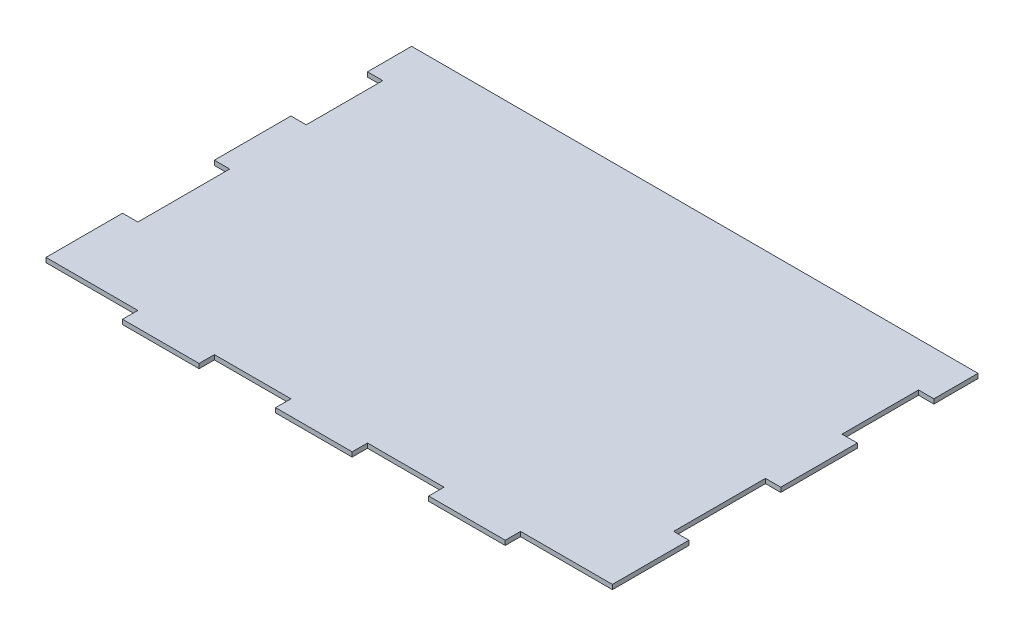
ISO-10303-21;
HEADER;
FILE_DESCRIPTION(('STEP AP214'),'2;1');
FILE_NAME('part.step','',(''),(''),'','','');
FILE_SCHEMA(('AUTOMOTIVE_DESIGN { 1 0 10303 214 1 1 1 1 }'));
ENDSEC;
DATA;
#1=APPLICATION_CONTEXT('core data for automotive mechanical design processes');
#2=APPLICATION_PROTOCOL_DEFINITION('international standard','automotive_design',2000,#1);
#3=PRODUCT_CONTEXT('',#1,'mechanical');
#4=PRODUCT('Part','Part','',(#3));
#5=PRODUCT_RELATED_PRODUCT_CATEGORY('part','',(#4));
#6=PRODUCT_DEFINITION_FORMATION('','',#4);
#7=PRODUCT_DEFINITION_CONTEXT('part definition',#1,'design');
#8=PRODUCT_DEFINITION('design','',#6,#7);
#9=PRODUCT_DEFINITION_SHAPE('','',#8);
#10=(LENGTH_UNIT() NAMED_UNIT(*) SI_UNIT(.MILLI.,.METRE.));
#11=(NAMED_UNIT(*) PLANE_ANGLE_UNIT() SI_UNIT($,.RADIAN.));
#12=(NAMED_UNIT(*) SI_UNIT($,.STERADIAN.) SOLID_ANGLE_UNIT());
#13=UNCERTAINTY_MEASURE_WITH_UNIT(LENGTH_MEASURE(1.E-05),#10,'distance_accuracy_value','');
#14=(GEOMETRIC_REPRESENTATION_CONTEXT(3) GLOBAL_UNCERTAINTY_ASSIGNED_CONTEXT((#13)) GLOBAL_UNIT_ASSIGNED_CONTEXT((#10,
#11,#12)) REPRESENTATION_CONTEXT('',''));
#15=CARTESIAN_POINT('',(0.,0.,0.));
#16=DIRECTION('',(0.,0.,1.));
#17=DIRECTION('',(1.,0.,0.));
#18=AXIS2_PLACEMENT_3D('',#15,#16,#17);
#19=CARTESIAN_POINT('',(75.0000000000001,3.,0.));
#20=DIRECTION('',(1.,0.,0.));
#21=DIRECTION('',(0.,0.,-1.));
#22=AXIS2_PLACEMENT_3D('',#19,#20,#21);
#23=PLANE('',#22);
#24=DIRECTION('',(0.,0.,1.));
#25=VECTOR('',#24,1.);
#26=CARTESIAN_POINT('',(75.0000000000001,0.,0.));
#27=LINE('',#26,#25);
#28=CARTESIAN_POINT('',(75.0000000000001,0.,149.434059405941));
#29=VERTEX_POINT('',#28);
#30=CARTESIAN_POINT('',(75.0000000000001,0.,159.434059405941));
#31=VERTEX_POINT('',#30);
#32=EDGE_CURVE('E276',#29,#31,#27,.T.);
#33=ORIENTED_EDGE('',*,*,#32,.T.);
#34=DIRECTION('',(0.,-1.,0.));
#35=VECTOR('',#34,1.);
#36=CARTESIAN_POINT('',(75.0000000000001,3.,159.434059405941));
#37=LINE('',#36,#35);
#38=CARTESIAN_POINT('',(75.0000000000001,3.,159.434059405941));
#39=VERTEX_POINT('',#38);
#40=EDGE_CURVE('E11',#39,#31,#37,.T.);
#41=ORIENTED_EDGE('',*,*,#40,.F.);
#42=DIRECTION('',(0.,0.,1.));
#43=VECTOR('',#42,1.);
#44=CARTESIAN_POINT('',(75.0000000000001,3.,0.));
#45=LINE('',#44,#43);
#46=CARTESIAN_POINT('',(75.0000000000001,3.,149.434059405941));
#47=VERTEX_POINT('',#46);
#48=EDGE_CURVE('E354',#47,#39,#45,.T.);
#49=ORIENTED_EDGE('',*,*,#48,.F.);
#50=DIRECTION('',(0.,-1.,0.));
#51=VECTOR('',#50,1.);
#52=CARTESIAN_POINT('',(75.0000000000001,3.,149.434059405941));
#53=LINE('',#52,#51);
#54=EDGE_CURVE('E272',#47,#29,#53,.T.);
#55=ORIENTED_EDGE('',*,*,#54,.T.);
#56=EDGE_LOOP('',(#33,#41,#49,#55));
#57=FACE_BOUND('',#56,.T.);
#58=ADVANCED_FACE('F36',(#57),#23,.F.);
#59=CARTESIAN_POINT('',(0.,3.,159.434059405941));
#60=DIRECTION('',(0.,0.,-1.));
#61=DIRECTION('',(-1.,0.,0.));
#62=AXIS2_PLACEMENT_3D('',#59,#60,#61);
#63=PLANE('',#62);
#64=DIRECTION('',(1.,0.,0.));
#65=VECTOR('',#64,1.);
#66=CARTESIAN_POINT('',(0.,0.,159.434059405941));
#67=LINE('',#66,#65);
#68=CARTESIAN_POINT('',(125.,0.,159.434059405941));
#69=VERTEX_POINT('',#68);
#70=EDGE_CURVE('E279',#31,#69,#67,.T.);
#71=ORIENTED_EDGE('',*,*,#70,.T.);
#72=DIRECTION('',(0.,-1.,0.));
#73=VECTOR('',#72,1.);
#74=CARTESIAN_POINT('',(125.,3.,159.434059405941));
#75=LINE('',#74,#73);
#76=CARTESIAN_POINT('',(125.,3.,159.434059405941));
#77=VERTEX_POINT('',#76);
#78=EDGE_CURVE('E44',#77,#69,#75,.T.);
#79=ORIENTED_EDGE('',*,*,#78,.F.);
#80=DIRECTION('',(1.,0.,0.));
#81=VECTOR('',#80,1.);
#82=CARTESIAN_POINT('',(0.,3.,159.434059405941));
#83=LINE('',#82,#81);
#84=EDGE_CURVE('E167',#39,#77,#83,.T.);
#85=ORIENTED_EDGE('',*,*,#84,.F.);
#86=ORIENTED_EDGE('',*,*,#40,.T.);
#87=EDGE_LOOP('',(#71,#79,#85,#86));
#88=FACE_BOUND('',#87,.T.);
#89=ADVANCED_FACE('F525',(#88),#63,.F.);
#90=CARTESIAN_POINT('',(125.,3.,0.));
#91=DIRECTION('',(-1.,0.,0.));
#92=DIRECTION('',(0.,0.,1.));
#93=AXIS2_PLACEMENT_3D('',#90,#91,#92);
#94=PLANE('',#93);
#95=DIRECTION('',(0.,0.,-1.));
#96=VECTOR('',#95,1.);
#97=CARTESIAN_POINT('',(125.,0.,0.));
#98=LINE('',#97,#96);
#99=CARTESIAN_POINT('',(125.,0.,149.434059405941));
#100=VERTEX_POINT('',#99);
#101=EDGE_CURVE('E281',#69,#100,#98,.T.);
#102=ORIENTED_EDGE('',*,*,#101,.T.);
#103=DIRECTION('',(0.,-1.,0.));
#104=VECTOR('',#103,1.);
#105=CARTESIAN_POINT('',(125.,3.,149.434059405941));
#106=LINE('',#105,#104);
#107=CARTESIAN_POINT('',(125.,3.,149.434059405941));
#108=VERTEX_POINT('',#107);
#109=EDGE_CURVE('E417',#108,#100,#106,.T.);
#110=ORIENTED_EDGE('',*,*,#109,.F.);
#111=DIRECTION('',(0.,0.,-1.));
#112=VECTOR('',#111,1.);
#113=CARTESIAN_POINT('',(125.,3.,0.));
#114=LINE('',#113,#112);
#115=EDGE_CURVE('E425',#77,#108,#114,.T.);
#116=ORIENTED_EDGE('',*,*,#115,.F.);
#117=ORIENTED_EDGE('',*,*,#78,.T.);
#118=EDGE_LOOP('',(#102,#110,#116,#117));
#119=FACE_BOUND('',#118,.T.);
#120=ADVANCED_FACE('F423',(#119),#94,.F.);
#121=CARTESIAN_POINT('',(1.65905133415679E-13,3.,149.434059405941));
#122=DIRECTION('',(0.,0.,-1.));
#123=DIRECTION('',(-1.,0.,0.));
#124=AXIS2_PLACEMENT_3D('',#121,#122,#123);
#125=PLANE('',#124);
#126=DIRECTION('',(1.,0.,0.));
#127=VECTOR('',#126,1.);
#128=CARTESIAN_POINT('',(1.65905133415679E-13,0.,149.434059405941));
#129=LINE('',#128,#127);
#130=CARTESIAN_POINT('',(185.,0.,149.434059405941));
#131=VERTEX_POINT('',#130);
#132=EDGE_CURVE('E283',#100,#131,#129,.T.);
#133=ORIENTED_EDGE('',*,*,#132,.T.);
#134=DIRECTION('',(0.,-1.,0.));
#135=VECTOR('',#134,1.);
#136=CARTESIAN_POINT('',(185.,3.,149.434059405941));
#137=LINE('',#136,#135);
#138=CARTESIAN_POINT('',(185.,3.,149.434059405941));
#139=VERTEX_POINT('',#138);
#140=EDGE_CURVE('E415',#139,#131,#137,.T.);
#141=ORIENTED_EDGE('',*,*,#140,.F.);
#142=DIRECTION('',(1.,0.,0.));
#143=VECTOR('',#142,1.);
#144=CARTESIAN_POINT('',(1.65905133415679E-13,3.,149.434059405941));
#145=LINE('',#144,#143);
#146=EDGE_CURVE('E437',#108,#139,#145,.T.);
#147=ORIENTED_EDGE('',*,*,#146,.F.);
#148=ORIENTED_EDGE('',*,*,#109,.T.);
#149=EDGE_LOOP('',(#133,#141,#147,#148));
#150=FACE_BOUND('',#149,.T.);
#151=ADVANCED_FACE('F434',(#150),#125,.F.);
#152=CARTESIAN_POINT('',(185.,3.,-1.02695629777827E-13));
#153=DIRECTION('',(1.,0.,0.));
#154=DIRECTION('',(0.,0.,-1.));
#155=AXIS2_PLACEMENT_3D('',#152,#153,#154);
#156=PLANE('',#155);
#157=DIRECTION('',(0.,0.,1.));
#158=VECTOR('',#157,1.);
#159=CARTESIAN_POINT('',(185.,0.,-1.02695629777827E-13));
#160=LINE('',#159,#158);
#161=CARTESIAN_POINT('',(185.,0.,99.4340594059405));
#162=VERTEX_POINT('',#161);
#163=EDGE_CURVE('E286',#162,#131,#160,.T.);
#164=ORIENTED_EDGE('',*,*,#163,.F.);
#165=DIRECTION('',(0.,-1.,0.));
#166=VECTOR('',#165,1.);
#167=CARTESIAN_POINT('',(185.,3.,99.4340594059405));
#168=LINE('',#167,#166);
#169=CARTESIAN_POINT('',(185.,3.,99.4340594059405));
#170=VERTEX_POINT('',#169);
#171=EDGE_CURVE('E413',#170,#162,#168,.T.);
#172=ORIENTED_EDGE('',*,*,#171,.F.);
#173=DIRECTION('',(0.,0.,1.));
#174=VECTOR('',#173,1.);
#175=CARTESIAN_POINT('',(185.,3.,-1.02695629777827E-13));
#176=LINE('',#175,#174);
#177=EDGE_CURVE('E439',#170,#139,#176,.T.);
#178=ORIENTED_EDGE('',*,*,#177,.T.);
#179=ORIENTED_EDGE('',*,*,#140,.T.);
#180=EDGE_LOOP('',(#164,#172,#178,#179));
#181=FACE_BOUND('',#180,.T.);
#182=ADVANCED_FACE('F536',(#181),#156,.T.);
#183=CARTESIAN_POINT('',(0.,3.,99.4340594059405));
#184=DIRECTION('',(0.,0.,1.));
#185=DIRECTION('',(1.,0.,0.));
#186=AXIS2_PLACEMENT_3D('',#183,#184,#185);
#187=PLANE('',#186);
#188=DIRECTION('',(-1.,0.,0.));
#189=VECTOR('',#188,1.);
#190=CARTESIAN_POINT('',(0.,0.,99.4340594059405));
#191=LINE('',#190,#189);
#192=CARTESIAN_POINT('',(175.,0.,99.4340594059405));
#193=VERTEX_POINT('',#192);
#194=EDGE_CURVE('E289',#162,#193,#191,.T.);
#195=ORIENTED_EDGE('',*,*,#194,.T.);
#196=DIRECTION('',(0.,-1.,0.));
#197=VECTOR('',#196,1.);
#198=CARTESIAN_POINT('',(175.,3.,99.4340594059405));
#199=LINE('',#198,#197);
#200=CARTESIAN_POINT('',(175.,3.,99.4340594059405));
#201=VERTEX_POINT('',#200);
#202=EDGE_CURVE('E410',#201,#193,#199,.T.);
#203=ORIENTED_EDGE('',*,*,#202,.F.);
#204=DIRECTION('',(-1.,0.,0.));
#205=VECTOR('',#204,1.);
#206=CARTESIAN_POINT('',(0.,3.,99.4340594059405));
#207=LINE('',#206,#205);
#208=EDGE_CURVE('E441',#170,#201,#207,.T.);
#209=ORIENTED_EDGE('',*,*,#208,.F.);
#210=ORIENTED_EDGE('',*,*,#171,.T.);
#211=EDGE_LOOP('',(#195,#203,#209,#210));
#212=FACE_BOUND('',#211,.T.);
#213=ADVANCED_FACE('F539',(#212),#187,.F.);
#214=CARTESIAN_POINT('',(175.,3.,0.));
#215=DIRECTION('',(-1.,0.,0.));
#216=DIRECTION('',(0.,0.,1.));
#217=AXIS2_PLACEMENT_3D('',#214,#215,#216);
#218=PLANE('',#217);
#219=DIRECTION('',(0.,0.,-1.));
#220=VECTOR('',#219,1.);
#221=CARTESIAN_POINT('',(175.,0.,0.));
#222=LINE('',#221,#220);
#223=CARTESIAN_POINT('',(175.,0.,39.4340594059406));
#224=VERTEX_POINT('',#223);
#225=EDGE_CURVE('E291',#193,#224,#222,.T.);
#226=ORIENTED_EDGE('',*,*,#225,.T.);
#227=DIRECTION('',(0.,-1.,0.));
#228=VECTOR('',#227,1.);
#229=CARTESIAN_POINT('',(175.,3.,39.4340594059406));
#230=LINE('',#229,#228);
#231=CARTESIAN_POINT('',(175.,3.,39.4340594059406));
#232=VERTEX_POINT('',#231);
#233=EDGE_CURVE('E407',#232,#224,#230,.T.);
#234=ORIENTED_EDGE('',*,*,#233,.F.);
#235=DIRECTION('',(0.,0.,-1.));
#236=VECTOR('',#235,1.);
#237=CARTESIAN_POINT('',(175.,3.,0.));
#238=LINE('',#237,#236);
#239=EDGE_CURVE('E447',#201,#232,#238,.T.);
#240=ORIENTED_EDGE('',*,*,#239,.F.);
#241=ORIENTED_EDGE('',*,*,#202,.T.);
#242=EDGE_LOOP('',(#226,#234,#240,#241));
#243=FACE_BOUND('',#242,.T.);
#244=ADVANCED_FACE('F543',(#243),#218,.F.);
#245=CARTESIAN_POINT('',(0.,3.,39.4340594059407));
#246=DIRECTION('',(0.,0.,-1.));
#247=DIRECTION('',(-1.,0.,0.));
#248=AXIS2_PLACEMENT_3D('',#245,#246,#247);
#249=PLANE('',#248);
#250=DIRECTION('',(1.,0.,0.));
#251=VECTOR('',#250,1.);
#252=CARTESIAN_POINT('',(0.,0.,39.4340594059407));
#253=LINE('',#252,#251);
#254=CARTESIAN_POINT('',(185.,0.,39.4340594059405));
#255=VERTEX_POINT('',#254);
#256=EDGE_CURVE('E293',#224,#255,#253,.T.);
#257=ORIENTED_EDGE('',*,*,#256,.T.);
#258=DIRECTION('',(0.,-1.,0.));
#259=VECTOR('',#258,1.);
#260=CARTESIAN_POINT('',(185.,3.,39.4340594059405));
#261=LINE('',#260,#259);
#262=CARTESIAN_POINT('',(185.,3.,39.4340594059405));
#263=VERTEX_POINT('',#262);
#264=EDGE_CURVE('E405',#263,#255,#261,.T.);
#265=ORIENTED_EDGE('',*,*,#264,.F.);
#266=DIRECTION('',(1.,0.,0.));
#267=VECTOR('',#266,1.);
#268=CARTESIAN_POINT('',(0.,3.,39.4340594059407));
#269=LINE('',#268,#267);
#270=EDGE_CURVE('E449',#232,#263,#269,.T.);
#271=ORIENTED_EDGE('',*,*,#270,.F.);
#272=ORIENTED_EDGE('',*,*,#233,.T.);
#273=EDGE_LOOP('',(#257,#265,#271,#272));
#274=FACE_BOUND('',#273,.T.);
#275=ADVANCED_FACE('F547',(#274),#249,.F.);
#276=CARTESIAN_POINT('',(185.,3.,-1.02695629777827E-13));
#277=DIRECTION('',(1.,0.,0.));
#278=DIRECTION('',(0.,0.,-1.));
#279=AXIS2_PLACEMENT_3D('',#276,#277,#278);
#280=PLANE('',#279);
#281=DIRECTION('',(0.,0.,1.));
#282=VECTOR('',#281,1.);
#283=CARTESIAN_POINT('',(185.,0.,-1.02695629777827E-13));
#284=LINE('',#283,#282);
#285=CARTESIAN_POINT('',(185.,0.,-10.5659405940595));
#286=VERTEX_POINT('',#285);
#287=EDGE_CURVE('E296',#286,#255,#284,.T.);
#288=ORIENTED_EDGE('',*,*,#287,.F.);
#289=DIRECTION('',(0.,-1.,0.));
#290=VECTOR('',#289,1.);
#291=CARTESIAN_POINT('',(185.,3.,-10.5659405940595));
#292=LINE('',#291,#290);
#293=CARTESIAN_POINT('',(185.,3.,-10.5659405940595));
#294=VERTEX_POINT('',#293);
#295=EDGE_CURVE('E403',#294,#286,#292,.T.);
#296=ORIENTED_EDGE('',*,*,#295,.F.);
#297=DIRECTION('',(0.,0.,1.));
#298=VECTOR('',#297,1.);
#299=CARTESIAN_POINT('',(185.,3.,-1.02695629777827E-13));
#300=LINE('',#299,#298);
#301=EDGE_CURVE('E451',#294,#263,#300,.T.);
#302=ORIENTED_EDGE('',*,*,#301,.T.);
#303=ORIENTED_EDGE('',*,*,#264,.T.);
#304=EDGE_LOOP('',(#288,#296,#302,#303));
#305=FACE_BOUND('',#304,.T.);
#306=ADVANCED_FACE('F551',(#305),#280,.T.);
#307=CARTESIAN_POINT('',(0.,3.,-10.5659405940595));
#308=DIRECTION('',(0.,0.,1.));
#309=DIRECTION('',(1.,0.,0.));
#310=AXIS2_PLACEMENT_3D('',#307,#308,#309);
#311=PLANE('',#310);
#312=DIRECTION('',(-1.,0.,0.));
#313=VECTOR('',#312,1.);
#314=CARTESIAN_POINT('',(0.,0.,-10.5659405940595));
#315=LINE('',#314,#313);
#316=CARTESIAN_POINT('',(175.,0.,-10.5659405940595));
#317=VERTEX_POINT('',#316);
#318=EDGE_CURVE('E299',#286,#317,#315,.T.);
#319=ORIENTED_EDGE('',*,*,#318,.T.);
#320=DIRECTION('',(0.,-1.,0.));
#321=VECTOR('',#320,1.);
#322=CARTESIAN_POINT('',(175.,3.,-10.5659405940595));
#323=LINE('',#322,#321);
#324=CARTESIAN_POINT('',(175.,3.,-10.5659405940595));
#325=VERTEX_POINT('',#324);
#326=EDGE_CURVE('E400',#325,#317,#323,.T.);
#327=ORIENTED_EDGE('',*,*,#326,.F.);
#328=DIRECTION('',(-1.,0.,0.));
#329=VECTOR('',#328,1.);
#330=CARTESIAN_POINT('',(0.,3.,-10.5659405940595));
#331=LINE('',#330,#329);
#332=EDGE_CURVE('E454',#294,#325,#331,.T.);
#333=ORIENTED_EDGE('',*,*,#332,.F.);
#334=ORIENTED_EDGE('',*,*,#295,.T.);
#335=EDGE_LOOP('',(#319,#327,#333,#334));
#336=FACE_BOUND('',#335,.T.);
#337=ADVANCED_FACE('F555',(#336),#311,.F.);
#338=CARTESIAN_POINT('',(175.,3.,0.));
#339=DIRECTION('',(-1.,0.,0.));
#340=DIRECTION('',(0.,0.,1.));
#341=AXIS2_PLACEMENT_3D('',#338,#339,#340);
#342=PLANE('',#341);
#343=DIRECTION('',(0.,0.,-1.));
#344=VECTOR('',#343,1.);
#345=CARTESIAN_POINT('',(175.,0.,0.));
#346=LINE('',#345,#344);
#347=CARTESIAN_POINT('',(175.,0.,-60.5659405940595));
#348=VERTEX_POINT('',#347);
#349=EDGE_CURVE('E301',#317,#348,#346,.T.);
#350=ORIENTED_EDGE('',*,*,#349,.T.);
#351=DIRECTION('',(0.,-1.,0.));
#352=VECTOR('',#351,1.);
#353=CARTESIAN_POINT('',(175.,3.,-60.5659405940595));
#354=LINE('',#353,#352);
#355=CARTESIAN_POINT('',(175.,3.,-60.5659405940595));
#356=VERTEX_POINT('',#355);
#357=EDGE_CURVE('E397',#356,#348,#354,.T.);
#358=ORIENTED_EDGE('',*,*,#357,.F.);
#359=DIRECTION('',(0.,0.,-1.));
#360=VECTOR('',#359,1.);
#361=CARTESIAN_POINT('',(175.,3.,0.));
#362=LINE('',#361,#360);
#363=EDGE_CURVE('E456',#325,#356,#362,.T.);
#364=ORIENTED_EDGE('',*,*,#363,.F.);
#365=ORIENTED_EDGE('',*,*,#326,.T.);
#366=EDGE_LOOP('',(#350,#358,#364,#365));
#367=FACE_BOUND('',#366,.T.);
#368=ADVANCED_FACE('F559',(#367),#342,.F.);
#369=CARTESIAN_POINT('',(0.,3.,-60.5659405940593));
#370=DIRECTION('',(0.,0.,-1.));
#371=DIRECTION('',(-1.,0.,0.));
#372=AXIS2_PLACEMENT_3D('',#369,#370,#371);
#373=PLANE('',#372);
#374=DIRECTION('',(1.,0.,0.));
#375=VECTOR('',#374,1.);
#376=CARTESIAN_POINT('',(0.,0.,-60.5659405940593));
#377=LINE('',#376,#375);
#378=CARTESIAN_POINT('',(185.,0.,-60.5659405940595));
#379=VERTEX_POINT('',#378);
#380=EDGE_CURVE('E303',#348,#379,#377,.T.);
#381=ORIENTED_EDGE('',*,*,#380,.T.);
#382=DIRECTION('',(0.,-1.,0.));
#383=VECTOR('',#382,1.);
#384=CARTESIAN_POINT('',(185.,3.,-60.5659405940595));
#385=LINE('',#384,#383);
#386=CARTESIAN_POINT('',(185.,3.,-60.5659405940595));
#387=VERTEX_POINT('',#386);
#388=EDGE_CURVE('E395',#387,#379,#385,.T.);
#389=ORIENTED_EDGE('',*,*,#388,.F.);
#390=DIRECTION('',(1.,0.,0.));
#391=VECTOR('',#390,1.);
#392=CARTESIAN_POINT('',(0.,3.,-60.5659405940593));
#393=LINE('',#392,#391);
#394=EDGE_CURVE('E458',#356,#387,#393,.T.);
#395=ORIENTED_EDGE('',*,*,#394,.F.);
#396=ORIENTED_EDGE('',*,*,#357,.T.);
#397=EDGE_LOOP('',(#381,#389,#395,#396));
#398=FACE_BOUND('',#397,.T.);
#399=ADVANCED_FACE('F563',(#398),#373,.F.);
#400=CARTESIAN_POINT('',(185.,3.,0.));
#401=DIRECTION('',(1.,0.,0.));
#402=DIRECTION('',(0.,0.,-1.));
#403=AXIS2_PLACEMENT_3D('',#400,#401,#402);
#404=PLANE('',#403);
#405=DIRECTION('',(0.,0.,1.));
#406=VECTOR('',#405,1.);
#407=CARTESIAN_POINT('',(185.,0.,0.));
#408=LINE('',#407,#406);
#409=CARTESIAN_POINT('',(185.,0.,-89.4059405940595));
#410=VERTEX_POINT('',#409);
#411=EDGE_CURVE('E306',#410,#379,#408,.T.);
#412=ORIENTED_EDGE('',*,*,#411,.F.);
#413=DIRECTION('',(0.,-1.,0.));
#414=VECTOR('',#413,1.);
#415=CARTESIAN_POINT('',(185.,3.,-89.4059405940595));
#416=LINE('',#415,#414);
#417=CARTESIAN_POINT('',(185.,3.,-89.4059405940595));
#418=VERTEX_POINT('',#417);
#419=EDGE_CURVE('E393',#418,#410,#416,.T.);
#420=ORIENTED_EDGE('',*,*,#419,.F.);
#421=DIRECTION('',(0.,0.,1.));
#422=VECTOR('',#421,1.);
#423=CARTESIAN_POINT('',(185.,3.,0.));
#424=LINE('',#423,#422);
#425=EDGE_CURVE('E460',#418,#387,#424,.T.);
#426=ORIENTED_EDGE('',*,*,#425,.T.);
#427=ORIENTED_EDGE('',*,*,#388,.T.);
#428=EDGE_LOOP('',(#412,#420,#426,#427));
#429=FACE_BOUND('',#428,.T.);
#430=ADVANCED_FACE('F567',(#429),#404,.T.);
#431=CARTESIAN_POINT('',(0.,3.,-89.4059405940594));
#432=DIRECTION('',(0.,0.,1.));
#433=DIRECTION('',(1.,0.,0.));
#434=AXIS2_PLACEMENT_3D('',#431,#432,#433);
#435=PLANE('',#434);
#436=DIRECTION('',(-1.,0.,0.));
#437=VECTOR('',#436,1.);
#438=CARTESIAN_POINT('',(0.,0.,-89.4059405940594));
#439=LINE('',#438,#437);
#440=CARTESIAN_POINT('',(-185.,0.,-89.4059405940594));
#441=VERTEX_POINT('',#440);
#442=EDGE_CURVE('E309',#410,#441,#439,.T.);
#443=ORIENTED_EDGE('',*,*,#442,.T.);
#444=DIRECTION('',(0.,-1.,0.));
#445=VECTOR('',#444,1.);
#446=CARTESIAN_POINT('',(-185.,3.,-89.4059405940594));
#447=LINE('',#446,#445);
#448=CARTESIAN_POINT('',(-185.,3.,-89.4059405940594));
#449=VERTEX_POINT('',#448);
#450=EDGE_CURVE('E390',#449,#441,#447,.T.);
#451=ORIENTED_EDGE('',*,*,#450,.F.);
#452=DIRECTION('',(-1.,0.,0.));
#453=VECTOR('',#452,1.);
#454=CARTESIAN_POINT('',(0.,3.,-89.4059405940594));
#455=LINE('',#454,#453);
#456=EDGE_CURVE('E463',#418,#449,#455,.T.);
#457=ORIENTED_EDGE('',*,*,#456,.F.);
#458=ORIENTED_EDGE('',*,*,#419,.T.);
#459=EDGE_LOOP('',(#443,#451,#457,#458));
#460=FACE_BOUND('',#459,.T.);
#461=ADVANCED_FACE('F571',(#460),#435,.F.);
#462=CARTESIAN_POINT('',(-185.,3.,0.));
#463=DIRECTION('',(1.,0.,0.));
#464=DIRECTION('',(0.,0.,-1.));
#465=AXIS2_PLACEMENT_3D('',#462,#463,#464);
#466=PLANE('',#465);
#467=DIRECTION('',(0.,0.,1.));
#468=VECTOR('',#467,1.);
#469=CARTESIAN_POINT('',(-185.,0.,0.));
#470=LINE('',#469,#468);
#471=CARTESIAN_POINT('',(-185.,0.,-60.5659405940594));
#472=VERTEX_POINT('',#471);
#473=EDGE_CURVE('E311',#441,#472,#470,.T.);
#474=ORIENTED_EDGE('',*,*,#473,.T.);
#475=DIRECTION('',(0.,-1.,0.));
#476=VECTOR('',#475,1.);
#477=CARTESIAN_POINT('',(-185.,3.,-60.5659405940594));
#478=LINE('',#477,#476);
#479=CARTESIAN_POINT('',(-185.,3.,-60.5659405940594));
#480=VERTEX_POINT('',#479);
#481=EDGE_CURVE('E388',#480,#472,#478,.T.);
#482=ORIENTED_EDGE('',*,*,#481,.F.);
#483=DIRECTION('',(0.,0.,1.));
#484=VECTOR('',#483,1.);
#485=CARTESIAN_POINT('',(-185.,3.,0.));
#486=LINE('',#485,#484);
#487=EDGE_CURVE('E465',#449,#480,#486,.T.);
#488=ORIENTED_EDGE('',*,*,#487,.F.);
#489=ORIENTED_EDGE('',*,*,#450,.T.);
#490=EDGE_LOOP('',(#474,#482,#488,#489));
#491=FACE_BOUND('',#490,.T.);
#492=ADVANCED_FACE('F575',(#491),#466,.F.);
#493=CARTESIAN_POINT('',(0.,3.,-60.5659405940594));
#494=DIRECTION('',(0.,0.,1.));
#495=DIRECTION('',(1.,0.,0.));
#496=AXIS2_PLACEMENT_3D('',#493,#494,#495);
#497=PLANE('',#496);
#498=DIRECTION('',(-1.,0.,0.));
#499=VECTOR('',#498,1.);
#500=CARTESIAN_POINT('',(0.,0.,-60.5659405940594));
#501=LINE('',#500,#499);
#502=CARTESIAN_POINT('',(-175.,0.,-60.5659405940594));
#503=VERTEX_POINT('',#502);
#504=EDGE_CURVE('E314',#503,#472,#501,.T.);
#505=ORIENTED_EDGE('',*,*,#504,.F.);
#506=DIRECTION('',(0.,-1.,0.));
#507=VECTOR('',#506,1.);
#508=CARTESIAN_POINT('',(-175.,3.,-60.5659405940594));
#509=LINE('',#508,#507);
#510=CARTESIAN_POINT('',(-175.,3.,-60.5659405940594));
#511=VERTEX_POINT('',#510);
#512=EDGE_CURVE('E386',#511,#503,#509,.T.);
#513=ORIENTED_EDGE('',*,*,#512,.F.);
#514=DIRECTION('',(-1.,0.,0.));
#515=VECTOR('',#514,1.);
#516=CARTESIAN_POINT('',(0.,3.,-60.5659405940594));
#517=LINE('',#516,#515);
#518=EDGE_CURVE('E467',#511,#480,#517,.T.);
#519=ORIENTED_EDGE('',*,*,#518,.T.);
#520=ORIENTED_EDGE('',*,*,#481,.T.);
#521=EDGE_LOOP('',(#505,#513,#519,#520));
#522=FACE_BOUND('',#521,.T.);
#523=ADVANCED_FACE('F579',(#522),#497,.T.);
#524=CARTESIAN_POINT('',(-175.,3.,0.));
#525=DIRECTION('',(-1.,0.,0.));
#526=DIRECTION('',(0.,0.,1.));
#527=AXIS2_PLACEMENT_3D('',#524,#525,#526);
#528=PLANE('',#527);
#529=DIRECTION('',(0.,0.,-1.));
#530=VECTOR('',#529,1.);
#531=CARTESIAN_POINT('',(-175.,0.,0.));
#532=LINE('',#531,#530);
#533=CARTESIAN_POINT('',(-175.,0.,-10.5659405940594));
#534=VERTEX_POINT('',#533);
#535=EDGE_CURVE('E317',#534,#503,#532,.T.);
#536=ORIENTED_EDGE('',*,*,#535,.F.);
#537=DIRECTION('',(0.,-1.,0.));
#538=VECTOR('',#537,1.);
#539=CARTESIAN_POINT('',(-175.,3.,-10.5659405940594));
#540=LINE('',#539,#538);
#541=CARTESIAN_POINT('',(-175.,3.,-10.5659405940594));
#542=VERTEX_POINT('',#541);
#543=EDGE_CURVE('E384',#542,#534,#540,.T.);
#544=ORIENTED_EDGE('',*,*,#543,.F.);
#545=DIRECTION('',(0.,0.,-1.));
#546=VECTOR('',#545,1.);
#547=CARTESIAN_POINT('',(-175.,3.,0.));
#548=LINE('',#547,#546);
#549=EDGE_CURVE('E470',#542,#511,#548,.T.);
#550=ORIENTED_EDGE('',*,*,#549,.T.);
#551=ORIENTED_EDGE('',*,*,#512,.T.);
#552=EDGE_LOOP('',(#536,#544,#550,#551));
#553=FACE_BOUND('',#552,.T.);
#554=ADVANCED_FACE('F583',(#553),#528,.T.);
#555=CARTESIAN_POINT('',(0.,3.,-10.5659405940594));
#556=DIRECTION('',(0.,0.,-1.));
#557=DIRECTION('',(-1.,0.,0.));
#558=AXIS2_PLACEMENT_3D('',#555,#556,#557);
#559=PLANE('',#558);
#560=DIRECTION('',(1.,0.,0.));
#561=VECTOR('',#560,1.);
#562=CARTESIAN_POINT('',(0.,0.,-10.5659405940594));
#563=LINE('',#562,#561);
#564=CARTESIAN_POINT('',(-185.,0.,-10.5659405940594));
#565=VERTEX_POINT('',#564);
#566=EDGE_CURVE('E320',#565,#534,#563,.T.);
#567=ORIENTED_EDGE('',*,*,#566,.F.);
#568=DIRECTION('',(0.,-1.,0.));
#569=VECTOR('',#568,1.);
#570=CARTESIAN_POINT('',(-185.,3.,-10.5659405940594));
#571=LINE('',#570,#569);
#572=CARTESIAN_POINT('',(-185.,3.,-10.5659405940594));
#573=VERTEX_POINT('',#572);
#574=EDGE_CURVE('E382',#573,#565,#571,.T.);
#575=ORIENTED_EDGE('',*,*,#574,.F.);
#576=DIRECTION('',(1.,0.,0.));
#577=VECTOR('',#576,1.);
#578=CARTESIAN_POINT('',(0.,3.,-10.5659405940594));
#579=LINE('',#578,#577);
#580=EDGE_CURVE('E473',#573,#542,#579,.T.);
#581=ORIENTED_EDGE('',*,*,#580,.T.);
#582=ORIENTED_EDGE('',*,*,#543,.T.);
#583=EDGE_LOOP('',(#567,#575,#581,#582));
#584=FACE_BOUND('',#583,.T.);
#585=ADVANCED_FACE('F587',(#584),#559,.T.);
#586=CARTESIAN_POINT('',(-185.,3.,1.02695629777827E-13));
#587=DIRECTION('',(-1.,0.,0.));
#588=DIRECTION('',(0.,0.,1.));
#589=AXIS2_PLACEMENT_3D('',#586,#587,#588);
#590=PLANE('',#589);
#591=DIRECTION('',(0.,0.,-1.));
#592=VECTOR('',#591,1.);
#593=CARTESIAN_POINT('',(-185.,0.,1.02695629777827E-13));
#594=LINE('',#593,#592);
#595=CARTESIAN_POINT('',(-185.,0.,39.4340594059406));
#596=VERTEX_POINT('',#595);
#597=EDGE_CURVE('E323',#596,#565,#594,.T.);
#598=ORIENTED_EDGE('',*,*,#597,.F.);
#599=DIRECTION('',(0.,-1.,0.));
#600=VECTOR('',#599,1.);
#601=CARTESIAN_POINT('',(-185.,3.,39.4340594059406));
#602=LINE('',#601,#600);
#603=CARTESIAN_POINT('',(-185.,3.,39.4340594059406));
#604=VERTEX_POINT('',#603);
#605=EDGE_CURVE('E380',#604,#596,#602,.T.);
#606=ORIENTED_EDGE('',*,*,#605,.F.);
#607=DIRECTION('',(0.,0.,-1.));
#608=VECTOR('',#607,1.);
#609=CARTESIAN_POINT('',(-185.,3.,1.02695629777827E-13));
#610=LINE('',#609,#608);
#611=EDGE_CURVE('E476',#604,#573,#610,.T.);
#612=ORIENTED_EDGE('',*,*,#611,.T.);
#613=ORIENTED_EDGE('',*,*,#574,.T.);
#614=EDGE_LOOP('',(#598,#606,#612,#613));
#615=FACE_BOUND('',#614,.T.);
#616=ADVANCED_FACE('F591',(#615),#590,.T.);
#617=CARTESIAN_POINT('',(0.,3.,39.4340594059406));
#618=DIRECTION('',(0.,0.,1.));
#619=DIRECTION('',(1.,0.,0.));
#620=AXIS2_PLACEMENT_3D('',#617,#618,#619);
#621=PLANE('',#620);
#622=DIRECTION('',(-1.,0.,0.));
#623=VECTOR('',#622,1.);
#624=CARTESIAN_POINT('',(0.,0.,39.4340594059406));
#625=LINE('',#624,#623);
#626=CARTESIAN_POINT('',(-175.,0.,39.4340594059406));
#627=VERTEX_POINT('',#626);
#628=EDGE_CURVE('E326',#627,#596,#625,.T.);
#629=ORIENTED_EDGE('',*,*,#628,.F.);
#630=DIRECTION('',(0.,-1.,0.));
#631=VECTOR('',#630,1.);
#632=CARTESIAN_POINT('',(-175.,3.,39.4340594059406));
#633=LINE('',#632,#631);
#634=CARTESIAN_POINT('',(-175.,3.,39.4340594059406));
#635=VERTEX_POINT('',#634);
#636=EDGE_CURVE('E378',#635,#627,#633,.T.);
#637=ORIENTED_EDGE('',*,*,#636,.F.);
#638=DIRECTION('',(-1.,0.,0.));
#639=VECTOR('',#638,1.);
#640=CARTESIAN_POINT('',(0.,3.,39.4340594059406));
#641=LINE('',#640,#639);
#642=EDGE_CURVE('E479',#635,#604,#641,.T.);
#643=ORIENTED_EDGE('',*,*,#642,.T.);
#644=ORIENTED_EDGE('',*,*,#605,.T.);
#645=EDGE_LOOP('',(#629,#637,#643,#644));
#646=FACE_BOUND('',#645,.T.);
#647=ADVANCED_FACE('F595',(#646),#621,.T.);
#648=CARTESIAN_POINT('',(-175.,3.,0.));
#649=DIRECTION('',(-1.,0.,0.));
#650=DIRECTION('',(0.,0.,1.));
#651=AXIS2_PLACEMENT_3D('',#648,#649,#650);
#652=PLANE('',#651);
#653=DIRECTION('',(0.,0.,-1.));
#654=VECTOR('',#653,1.);
#655=CARTESIAN_POINT('',(-175.,0.,0.));
#656=LINE('',#655,#654);
#657=CARTESIAN_POINT('',(-175.,0.,99.4340594059406));
#658=VERTEX_POINT('',#657);
#659=EDGE_CURVE('E329',#658,#627,#656,.T.);
#660=ORIENTED_EDGE('',*,*,#659,.F.);
#661=DIRECTION('',(0.,-1.,0.));
#662=VECTOR('',#661,1.);
#663=CARTESIAN_POINT('',(-175.,3.,99.4340594059406));
#664=LINE('',#663,#662);
#665=CARTESIAN_POINT('',(-175.,3.,99.4340594059406));
#666=VERTEX_POINT('',#665);
#667=EDGE_CURVE('E376',#666,#658,#664,.T.);
#668=ORIENTED_EDGE('',*,*,#667,.F.);
#669=DIRECTION('',(0.,0.,-1.));
#670=VECTOR('',#669,1.);
#671=CARTESIAN_POINT('',(-175.,3.,0.));
#672=LINE('',#671,#670);
#673=EDGE_CURVE('E482',#666,#635,#672,.T.);
#674=ORIENTED_EDGE('',*,*,#673,.T.);
#675=ORIENTED_EDGE('',*,*,#636,.T.);
#676=EDGE_LOOP('',(#660,#668,#674,#675));
#677=FACE_BOUND('',#676,.T.);
#678=ADVANCED_FACE('F599',(#677),#652,.T.);
#679=CARTESIAN_POINT('',(0.,3.,99.4340594059406));
#680=DIRECTION('',(0.,0.,-1.));
#681=DIRECTION('',(-1.,0.,0.));
#682=AXIS2_PLACEMENT_3D('',#679,#680,#681);
#683=PLANE('',#682);
#684=DIRECTION('',(1.,0.,0.));
#685=VECTOR('',#684,1.);
#686=CARTESIAN_POINT('',(0.,0.,99.4340594059406));
#687=LINE('',#686,#685);
#688=CARTESIAN_POINT('',(-185.,0.,99.4340594059406));
#689=VERTEX_POINT('',#688);
#690=EDGE_CURVE('E332',#689,#658,#687,.T.);
#691=ORIENTED_EDGE('',*,*,#690,.F.);
#692=DIRECTION('',(0.,-1.,0.));
#693=VECTOR('',#692,1.);
#694=CARTESIAN_POINT('',(-185.,3.,99.4340594059406));
#695=LINE('',#694,#693);
#696=CARTESIAN_POINT('',(-185.,3.,99.4340594059406));
#697=VERTEX_POINT('',#696);
#698=EDGE_CURVE('E374',#697,#689,#695,.T.);
#699=ORIENTED_EDGE('',*,*,#698,.F.);
#700=DIRECTION('',(1.,0.,0.));
#701=VECTOR('',#700,1.);
#702=CARTESIAN_POINT('',(0.,3.,99.4340594059406));
#703=LINE('',#702,#701);
#704=EDGE_CURVE('E485',#697,#666,#703,.T.);
#705=ORIENTED_EDGE('',*,*,#704,.T.);
#706=ORIENTED_EDGE('',*,*,#667,.T.);
#707=EDGE_LOOP('',(#691,#699,#705,#706));
#708=FACE_BOUND('',#707,.T.);
#709=ADVANCED_FACE('F603',(#708),#683,.T.);
#710=CARTESIAN_POINT('',(-185.,3.,-1.02695629777827E-13));
#711=DIRECTION('',(-1.,0.,0.));
#712=DIRECTION('',(0.,0.,1.));
#713=AXIS2_PLACEMENT_3D('',#710,#711,#712);
#714=PLANE('',#713);
#715=DIRECTION('',(0.,0.,-1.));
#716=VECTOR('',#715,1.);
#717=CARTESIAN_POINT('',(-185.,0.,-1.02695629777827E-13));
#718=LINE('',#717,#716);
#719=CARTESIAN_POINT('',(-185.,0.,149.434059405941));
#720=VERTEX_POINT('',#719);
#721=EDGE_CURVE('E335',#720,#689,#718,.T.);
#722=ORIENTED_EDGE('',*,*,#721,.F.);
#723=DIRECTION('',(0.,-1.,0.));
#724=VECTOR('',#723,1.);
#725=CARTESIAN_POINT('',(-185.,3.,149.434059405941));
#726=LINE('',#725,#724);
#727=CARTESIAN_POINT('',(-185.,3.,149.434059405941));
#728=VERTEX_POINT('',#727);
#729=EDGE_CURVE('E372',#728,#720,#726,.T.);
#730=ORIENTED_EDGE('',*,*,#729,.F.);
#731=DIRECTION('',(0.,0.,-1.));
#732=VECTOR('',#731,1.);
#733=CARTESIAN_POINT('',(-185.,3.,-1.02695629777827E-13));
#734=LINE('',#733,#732);
#735=EDGE_CURVE('E488',#728,#697,#734,.T.);
#736=ORIENTED_EDGE('',*,*,#735,.T.);
#737=ORIENTED_EDGE('',*,*,#698,.T.);
#738=EDGE_LOOP('',(#722,#730,#736,#737));
#739=FACE_BOUND('',#738,.T.);
#740=ADVANCED_FACE('F607',(#739),#714,.T.);
#741=CARTESIAN_POINT('',(0.,3.,149.434059405941));
#742=DIRECTION('',(0.,0.,1.));
#743=DIRECTION('',(1.,0.,0.));
#744=AXIS2_PLACEMENT_3D('',#741,#742,#743);
#745=PLANE('',#744);
#746=DIRECTION('',(-1.,0.,0.));
#747=VECTOR('',#746,1.);
#748=CARTESIAN_POINT('',(0.,0.,149.434059405941));
#749=LINE('',#748,#747);
#750=CARTESIAN_POINT('',(-125.,0.,149.434059405941));
#751=VERTEX_POINT('',#750);
#752=EDGE_CURVE('E338',#751,#720,#749,.T.);
#753=ORIENTED_EDGE('',*,*,#752,.F.);
#754=DIRECTION('',(0.,-1.,0.));
#755=VECTOR('',#754,1.);
#756=CARTESIAN_POINT('',(-125.,3.,149.434059405941));
#757=LINE('',#756,#755);
#758=CARTESIAN_POINT('',(-125.,3.,149.434059405941));
#759=VERTEX_POINT('',#758);
#760=EDGE_CURVE('E370',#759,#751,#757,.T.);
#761=ORIENTED_EDGE('',*,*,#760,.F.);
#762=DIRECTION('',(-1.,0.,0.));
#763=VECTOR('',#762,1.);
#764=CARTESIAN_POINT('',(0.,3.,149.434059405941));
#765=LINE('',#764,#763);
#766=EDGE_CURVE('E491',#759,#728,#765,.T.);
#767=ORIENTED_EDGE('',*,*,#766,.T.);
#768=ORIENTED_EDGE('',*,*,#729,.T.);
#769=EDGE_LOOP('',(#753,#761,#767,#768));
#770=FACE_BOUND('',#769,.T.);
#771=ADVANCED_FACE('F611',(#770),#745,.T.);
#772=CARTESIAN_POINT('',(-125.,3.,0.));
#773=DIRECTION('',(1.,0.,0.));
#774=DIRECTION('',(0.,0.,-1.));
#775=AXIS2_PLACEMENT_3D('',#772,#773,#774);
#776=PLANE('',#775);
#777=DIRECTION('',(0.,0.,1.));
#778=VECTOR('',#777,1.);
#779=CARTESIAN_POINT('',(-125.,0.,0.));
#780=LINE('',#779,#778);
#781=CARTESIAN_POINT('',(-125.,0.,159.434059405941));
#782=VERTEX_POINT('',#781);
#783=EDGE_CURVE('E341',#751,#782,#780,.T.);
#784=ORIENTED_EDGE('',*,*,#783,.T.);
#785=DIRECTION('',(0.,-1.,0.));
#786=VECTOR('',#785,1.);
#787=CARTESIAN_POINT('',(-125.,3.,159.434059405941));
#788=LINE('',#787,#786);
#789=CARTESIAN_POINT('',(-125.,3.,159.434059405941));
#790=VERTEX_POINT('',#789);
#791=EDGE_CURVE('E367',#790,#782,#788,.T.);
#792=ORIENTED_EDGE('',*,*,#791,.F.);
#793=DIRECTION('',(0.,0.,1.));
#794=VECTOR('',#793,1.);
#795=CARTESIAN_POINT('',(-125.,3.,0.));
#796=LINE('',#795,#794);
#797=EDGE_CURVE('E494',#759,#790,#796,.T.);
#798=ORIENTED_EDGE('',*,*,#797,.F.);
#799=ORIENTED_EDGE('',*,*,#760,.T.);
#800=EDGE_LOOP('',(#784,#792,#798,#799));
#801=FACE_BOUND('',#800,.T.);
#802=ADVANCED_FACE('F615',(#801),#776,.F.);
#803=CARTESIAN_POINT('',(0.,3.,159.434059405941));
#804=DIRECTION('',(0.,0.,-1.));
#805=DIRECTION('',(-1.,0.,0.));
#806=AXIS2_PLACEMENT_3D('',#803,#804,#805);
#807=PLANE('',#806);
#808=DIRECTION('',(1.,0.,0.));
#809=VECTOR('',#808,1.);
#810=CARTESIAN_POINT('',(0.,0.,159.434059405941));
#811=LINE('',#810,#809);
#812=CARTESIAN_POINT('',(-75.,0.,159.434059405941));
#813=VERTEX_POINT('',#812);
#814=EDGE_CURVE('E343',#782,#813,#811,.T.);
#815=ORIENTED_EDGE('',*,*,#814,.T.);
#816=DIRECTION('',(0.,-1.,0.));
#817=VECTOR('',#816,1.);
#818=CARTESIAN_POINT('',(-75.,3.,159.434059405941));
#819=LINE('',#818,#817);
#820=CARTESIAN_POINT('',(-75.,3.,159.434059405941));
#821=VERTEX_POINT('',#820);
#822=EDGE_CURVE('E364',#821,#813,#819,.T.);
#823=ORIENTED_EDGE('',*,*,#822,.F.);
#824=DIRECTION('',(1.,0.,0.));
#825=VECTOR('',#824,1.);
#826=CARTESIAN_POINT('',(0.,3.,159.434059405941));
#827=LINE('',#826,#825);
#828=EDGE_CURVE('E496',#790,#821,#827,.T.);
#829=ORIENTED_EDGE('',*,*,#828,.F.);
#830=ORIENTED_EDGE('',*,*,#791,.T.);
#831=EDGE_LOOP('',(#815,#823,#829,#830));
#832=FACE_BOUND('',#831,.T.);
#833=ADVANCED_FACE('F619',(#832),#807,.F.);
#834=CARTESIAN_POINT('',(-75.,3.,0.));
#835=DIRECTION('',(-1.,0.,0.));
#836=DIRECTION('',(0.,0.,1.));
#837=AXIS2_PLACEMENT_3D('',#834,#835,#836);
#838=PLANE('',#837);
#839=DIRECTION('',(0.,0.,-1.));
#840=VECTOR('',#839,1.);
#841=CARTESIAN_POINT('',(-75.,0.,0.));
#842=LINE('',#841,#840);
#843=CARTESIAN_POINT('',(-75.,0.,149.434059405941));
#844=VERTEX_POINT('',#843);
#845=EDGE_CURVE('E345',#813,#844,#842,.T.);
#846=ORIENTED_EDGE('',*,*,#845,.T.);
#847=DIRECTION('',(0.,-1.,0.));
#848=VECTOR('',#847,1.);
#849=CARTESIAN_POINT('',(-75.,3.,149.434059405941));
#850=LINE('',#849,#848);
#851=CARTESIAN_POINT('',(-75.,3.,149.434059405941));
#852=VERTEX_POINT('',#851);
#853=EDGE_CURVE('E361',#852,#844,#850,.T.);
#854=ORIENTED_EDGE('',*,*,#853,.F.);
#855=DIRECTION('',(0.,0.,-1.));
#856=VECTOR('',#855,1.);
#857=CARTESIAN_POINT('',(-75.,3.,0.));
#858=LINE('',#857,#856);
#859=EDGE_CURVE('E498',#821,#852,#858,.T.);
#860=ORIENTED_EDGE('',*,*,#859,.F.);
#861=ORIENTED_EDGE('',*,*,#822,.T.);
#862=EDGE_LOOP('',(#846,#854,#860,#861));
#863=FACE_BOUND('',#862,.T.);
#864=ADVANCED_FACE('F623',(#863),#838,.F.);
#865=CARTESIAN_POINT('',(0.,3.,149.434059405941));
#866=DIRECTION('',(0.,0.,-1.));
#867=DIRECTION('',(-1.,0.,0.));
#868=AXIS2_PLACEMENT_3D('',#865,#866,#867);
#869=PLANE('',#868);
#870=DIRECTION('',(1.,0.,0.));
#871=VECTOR('',#870,1.);
#872=CARTESIAN_POINT('',(0.,0.,149.434059405941));
#873=LINE('',#872,#871);
#874=CARTESIAN_POINT('',(-25.,0.,149.434059405941));
#875=VERTEX_POINT('',#874);
#876=EDGE_CURVE('E347',#844,#875,#873,.T.);
#877=ORIENTED_EDGE('',*,*,#876,.T.);
#878=DIRECTION('',(0.,-1.,0.));
#879=VECTOR('',#878,1.);
#880=CARTESIAN_POINT('',(-25.,3.,149.434059405941));
#881=LINE('',#880,#879);
#882=CARTESIAN_POINT('',(-25.,3.,149.434059405941));
#883=VERTEX_POINT('',#882);
#884=EDGE_CURVE('E358',#883,#875,#881,.T.);
#885=ORIENTED_EDGE('',*,*,#884,.F.);
#886=DIRECTION('',(1.,0.,0.));
#887=VECTOR('',#886,1.);
#888=CARTESIAN_POINT('',(0.,3.,149.434059405941));
#889=LINE('',#888,#887);
#890=EDGE_CURVE('E500',#852,#883,#889,.T.);
#891=ORIENTED_EDGE('',*,*,#890,.F.);
#892=ORIENTED_EDGE('',*,*,#853,.T.);
#893=EDGE_LOOP('',(#877,#885,#891,#892));
#894=FACE_BOUND('',#893,.T.);
#895=ADVANCED_FACE('F506',(#894),#869,.F.);
#896=CARTESIAN_POINT('',(-25.,3.,0.));
#897=DIRECTION('',(1.,0.,0.));
#898=DIRECTION('',(0.,0.,-1.));
#899=AXIS2_PLACEMENT_3D('',#896,#897,#898);
#900=PLANE('',#899);
#901=DIRECTION('',(0.,0.,1.));
#902=VECTOR('',#901,1.);
#903=CARTESIAN_POINT('',(-25.,0.,0.));
#904=LINE('',#903,#902);
#905=CARTESIAN_POINT('',(-25.,0.,159.434059405941));
#906=VERTEX_POINT('',#905);
#907=EDGE_CURVE('E349',#875,#906,#904,.T.);
#908=ORIENTED_EDGE('',*,*,#907,.T.);
#909=DIRECTION('',(0.,-1.,0.));
#910=VECTOR('',#909,1.);
#911=CARTESIAN_POINT('',(-25.,3.,159.434059405941));
#912=LINE('',#911,#910);
#913=CARTESIAN_POINT('',(-25.,3.,159.434059405941));
#914=VERTEX_POINT('',#913);
#915=EDGE_CURVE('E267',#914,#906,#912,.T.);
#916=ORIENTED_EDGE('',*,*,#915,.F.);
#917=DIRECTION('',(0.,0.,1.));
#918=VECTOR('',#917,1.);
#919=CARTESIAN_POINT('',(-25.,3.,0.));
#920=LINE('',#919,#918);
#921=EDGE_CURVE('E258',#883,#914,#920,.T.);
#922=ORIENTED_EDGE('',*,*,#921,.F.);
#923=ORIENTED_EDGE('',*,*,#884,.T.);
#924=EDGE_LOOP('',(#908,#916,#922,#923));
#925=FACE_BOUND('',#924,.T.);
#926=ADVANCED_FACE('F510',(#925),#900,.F.);
#927=CARTESIAN_POINT('',(0.,3.,159.434059405941));
#928=DIRECTION('',(0.,0.,-1.));
#929=DIRECTION('',(-1.,0.,0.));
#930=AXIS2_PLACEMENT_3D('',#927,#928,#929);
#931=PLANE('',#930);
#932=DIRECTION('',(1.,0.,0.));
#933=VECTOR('',#932,1.);
#934=CARTESIAN_POINT('',(0.,0.,159.434059405941));
#935=LINE('',#934,#933);
#936=CARTESIAN_POINT('',(25.,0.,159.434059405941));
#937=VERTEX_POINT('',#936);
#938=EDGE_CURVE('E266',#906,#937,#935,.T.);
#939=ORIENTED_EDGE('',*,*,#938,.T.);
#940=DIRECTION('',(0.,-1.,0.));
#941=VECTOR('',#940,1.);
#942=CARTESIAN_POINT('',(25.,3.,159.434059405941));
#943=LINE('',#942,#941);
#944=CARTESIAN_POINT('',(25.,3.,159.434059405941));
#945=VERTEX_POINT('',#944);
#946=EDGE_CURVE('E263',#945,#937,#943,.T.);
#947=ORIENTED_EDGE('',*,*,#946,.F.);
#948=DIRECTION('',(1.,0.,0.));
#949=VECTOR('',#948,1.);
#950=CARTESIAN_POINT('',(0.,3.,159.434059405941));
#951=LINE('',#950,#949);
#952=EDGE_CURVE('E252',#914,#945,#951,.T.);
#953=ORIENTED_EDGE('',*,*,#952,.F.);
#954=ORIENTED_EDGE('',*,*,#915,.T.);
#955=EDGE_LOOP('',(#939,#947,#953,#954));
#956=FACE_BOUND('',#955,.T.);
#957=ADVANCED_FACE('F264',(#956),#931,.F.);
#958=CARTESIAN_POINT('',(25.,3.,0.));
#959=DIRECTION('',(-1.,0.,0.));
#960=DIRECTION('',(0.,0.,1.));
#961=AXIS2_PLACEMENT_3D('',#958,#959,#960);
#962=PLANE('',#961);
#963=DIRECTION('',(0.,0.,-1.));
#964=VECTOR('',#963,1.);
#965=CARTESIAN_POINT('',(25.,0.,0.));
#966=LINE('',#965,#964);
#967=CARTESIAN_POINT('',(25.,0.,149.434059405941));
#968=VERTEX_POINT('',#967);
#969=EDGE_CURVE('E153',#937,#968,#966,.T.);
#970=ORIENTED_EDGE('',*,*,#969,.T.);
#971=DIRECTION('',(0.,-1.,0.));
#972=VECTOR('',#971,1.);
#973=CARTESIAN_POINT('',(25.,3.,149.434059405941));
#974=LINE('',#973,#972);
#975=CARTESIAN_POINT('',(25.,3.,149.434059405941));
#976=VERTEX_POINT('',#975);
#977=EDGE_CURVE('E268',#976,#968,#974,.T.);
#978=ORIENTED_EDGE('',*,*,#977,.F.);
#979=DIRECTION('',(0.,0.,-1.));
#980=VECTOR('',#979,1.);
#981=CARTESIAN_POINT('',(25.,3.,0.));
#982=LINE('',#981,#980);
#983=EDGE_CURVE('E256',#945,#976,#982,.T.);
#984=ORIENTED_EDGE('',*,*,#983,.F.);
#985=ORIENTED_EDGE('',*,*,#946,.T.);
#986=EDGE_LOOP('',(#970,#978,#984,#985));
#987=FACE_BOUND('',#986,.T.);
#988=ADVANCED_FACE('F270',(#987),#962,.F.);
#989=CARTESIAN_POINT('',(0.,3.,149.434059405941));
#990=DIRECTION('',(0.,0.,-1.));
#991=DIRECTION('',(-1.,0.,0.));
#992=AXIS2_PLACEMENT_3D('',#989,#990,#991);
#993=PLANE('',#992);
#994=DIRECTION('',(1.,0.,0.));
#995=VECTOR('',#994,1.);
#996=CARTESIAN_POINT('',(0.,0.,149.434059405941));
#997=LINE('',#996,#995);
#998=EDGE_CURVE('E159',#968,#29,#997,.T.);
#999=ORIENTED_EDGE('',*,*,#998,.T.);
#1000=ORIENTED_EDGE('',*,*,#54,.F.);
#1001=DIRECTION('',(1.,0.,0.));
#1002=VECTOR('',#1001,1.);
#1003=CARTESIAN_POINT('',(0.,3.,149.434059405941));
#1004=LINE('',#1003,#1002);
#1005=EDGE_CURVE('E52',#976,#47,#1004,.T.);
#1006=ORIENTED_EDGE('',*,*,#1005,.F.);
#1007=ORIENTED_EDGE('',*,*,#977,.T.);
#1008=EDGE_LOOP('',(#999,#1000,#1006,#1007));
#1009=FACE_BOUND('',#1008,.T.);
#1010=ADVANCED_FACE('F514',(#1009),#993,.F.);
#1011=CARTESIAN_POINT('',(0.,3.,0.));
#1012=DIRECTION('',(0.,1.,0.));
#1013=DIRECTION('',(0.,0.,1.));
#1014=AXIS2_PLACEMENT_3D('',#1011,#1012,#1013);
#1015=PLANE('',#1014);
#1016=ORIENTED_EDGE('',*,*,#48,.T.);
#1017=ORIENTED_EDGE('',*,*,#84,.T.);
#1018=ORIENTED_EDGE('',*,*,#115,.T.);
#1019=ORIENTED_EDGE('',*,*,#146,.T.);
#1020=ORIENTED_EDGE('',*,*,#177,.F.);
#1021=ORIENTED_EDGE('',*,*,#208,.T.);
#1022=ORIENTED_EDGE('',*,*,#239,.T.);
#1023=ORIENTED_EDGE('',*,*,#270,.T.);
#1024=ORIENTED_EDGE('',*,*,#301,.F.);
#1025=ORIENTED_EDGE('',*,*,#332,.T.);
#1026=ORIENTED_EDGE('',*,*,#363,.T.);
#1027=ORIENTED_EDGE('',*,*,#394,.T.);
#1028=ORIENTED_EDGE('',*,*,#425,.F.);
#1029=ORIENTED_EDGE('',*,*,#456,.T.);
#1030=ORIENTED_EDGE('',*,*,#487,.T.);
#1031=ORIENTED_EDGE('',*,*,#518,.F.);
#1032=ORIENTED_EDGE('',*,*,#549,.F.);
#1033=ORIENTED_EDGE('',*,*,#580,.F.);
#1034=ORIENTED_EDGE('',*,*,#611,.F.);
#1035=ORIENTED_EDGE('',*,*,#642,.F.);
#1036=ORIENTED_EDGE('',*,*,#673,.F.);
#1037=ORIENTED_EDGE('',*,*,#704,.F.);
#1038=ORIENTED_EDGE('',*,*,#735,.F.);
#1039=ORIENTED_EDGE('',*,*,#766,.F.);
#1040=ORIENTED_EDGE('',*,*,#797,.T.);
#1041=ORIENTED_EDGE('',*,*,#828,.T.);
#1042=ORIENTED_EDGE('',*,*,#859,.T.);
#1043=ORIENTED_EDGE('',*,*,#890,.T.);
#1044=ORIENTED_EDGE('',*,*,#921,.T.);
#1045=ORIENTED_EDGE('',*,*,#952,.T.);
#1046=ORIENTED_EDGE('',*,*,#983,.T.);
#1047=ORIENTED_EDGE('',*,*,#1005,.T.);
#1048=EDGE_LOOP('',(#1016,#1017,#1018,#1019,#1020,#1021,#1022,#1023,#1024,#1025,#1026,#1027,
#1028,#1029,#1030,#1031,#1032,#1033,#1034,#1035,#1036,#1037,#1038,#1039,#1040,#1041,#1042,#1043,
#1044,#1045,#1046,#1047));
#1049=FACE_BOUND('',#1048,.T.);
#1050=ADVANCED_FACE('F254',(#1049),#1015,.T.);
#1051=CARTESIAN_POINT('',(0.,0.,0.));
#1052=DIRECTION('',(0.,1.,0.));
#1053=DIRECTION('',(0.,0.,1.));
#1054=AXIS2_PLACEMENT_3D('',#1051,#1052,#1053);
#1055=PLANE('',#1054);
#1056=ORIENTED_EDGE('',*,*,#32,.F.);
#1057=ORIENTED_EDGE('',*,*,#998,.F.);
#1058=ORIENTED_EDGE('',*,*,#969,.F.);
#1059=ORIENTED_EDGE('',*,*,#938,.F.);
#1060=ORIENTED_EDGE('',*,*,#907,.F.);
#1061=ORIENTED_EDGE('',*,*,#876,.F.);
#1062=ORIENTED_EDGE('',*,*,#845,.F.);
#1063=ORIENTED_EDGE('',*,*,#814,.F.);
#1064=ORIENTED_EDGE('',*,*,#783,.F.);
#1065=ORIENTED_EDGE('',*,*,#752,.T.);
#1066=ORIENTED_EDGE('',*,*,#721,.T.);
#1067=ORIENTED_EDGE('',*,*,#690,.T.);
#1068=ORIENTED_EDGE('',*,*,#659,.T.);
#1069=ORIENTED_EDGE('',*,*,#628,.T.);
#1070=ORIENTED_EDGE('',*,*,#597,.T.);
#1071=ORIENTED_EDGE('',*,*,#566,.T.);
#1072=ORIENTED_EDGE('',*,*,#535,.T.);
#1073=ORIENTED_EDGE('',*,*,#504,.T.);
#1074=ORIENTED_EDGE('',*,*,#473,.F.);
#1075=ORIENTED_EDGE('',*,*,#442,.F.);
#1076=ORIENTED_EDGE('',*,*,#411,.T.);
#1077=ORIENTED_EDGE('',*,*,#380,.F.);
#1078=ORIENTED_EDGE('',*,*,#349,.F.);
#1079=ORIENTED_EDGE('',*,*,#318,.F.);
#1080=ORIENTED_EDGE('',*,*,#287,.T.);
#1081=ORIENTED_EDGE('',*,*,#256,.F.);
#1082=ORIENTED_EDGE('',*,*,#225,.F.);
#1083=ORIENTED_EDGE('',*,*,#194,.F.);
#1084=ORIENTED_EDGE('',*,*,#163,.T.);
#1085=ORIENTED_EDGE('',*,*,#132,.F.);
#1086=ORIENTED_EDGE('',*,*,#101,.F.);
#1087=ORIENTED_EDGE('',*,*,#70,.F.);
#1088=EDGE_LOOP('',(#1056,#1057,#1058,#1059,#1060,#1061,#1062,#1063,#1064,#1065,#1066,#1067,
#1068,#1069,#1070,#1071,#1072,#1073,#1074,#1075,#1076,#1077,#1078,#1079,#1080,#1081,#1082,#1083,
#1084,#1085,#1086,#1087));
#1089=FACE_BOUND('',#1088,.T.);
#1090=ADVANCED_FACE('F429',(#1089),#1055,.F.);
#1091=CLOSED_SHELL('',(#58,#89,#120,#151,#182,#213,#244,#275,#306,#337,#368,#399,#430,#461,#492,
#523,#554,#585,#616,#647,#678,#709,#740,#771,#802,#833,#864,#895,#926,#957,#988,#1010,#1050,#1090));
#1092=MANIFOLD_SOLID_BREP('B2',#1091);
#1093=ADVANCED_BREP_SHAPE_REPRESENTATION('',(#18,#1092),#14);
#1094=SHAPE_DEFINITION_REPRESENTATION(#9,#1093);
ENDSEC;
END-ISO-10303-21;
